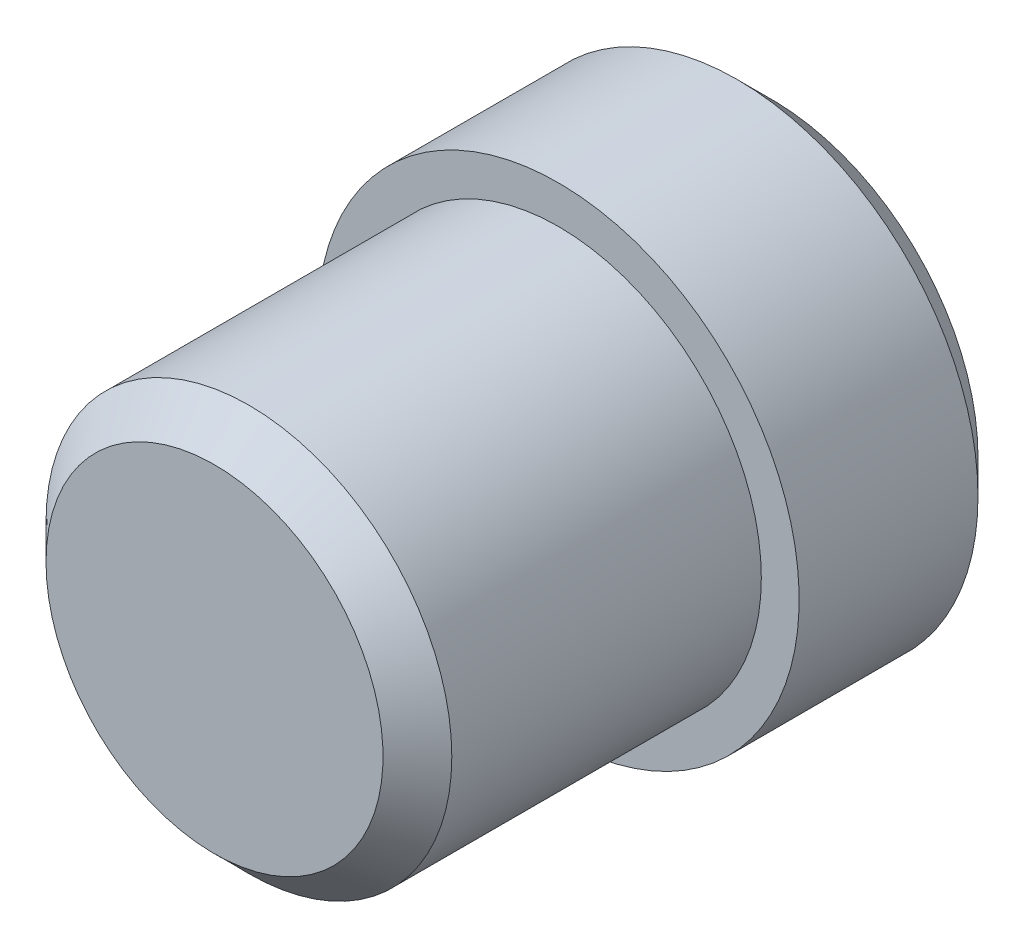
ISO-10303-21;
HEADER;
FILE_DESCRIPTION(('STEP AP214'),'2;1');
FILE_NAME('part.step','',(''),(''),'','','');
FILE_SCHEMA(('AUTOMOTIVE_DESIGN { 1 0 10303 214 1 1 1 1 }'));
ENDSEC;
DATA;
#1=APPLICATION_CONTEXT('core data for automotive mechanical design processes');
#2=APPLICATION_PROTOCOL_DEFINITION('international standard','automotive_design',2000,#1);
#3=PRODUCT_CONTEXT('',#1,'mechanical');
#4=PRODUCT('Part','Part','',(#3));
#5=PRODUCT_RELATED_PRODUCT_CATEGORY('part','',(#4));
#6=PRODUCT_DEFINITION_FORMATION('','',#4);
#7=PRODUCT_DEFINITION_CONTEXT('part definition',#1,'design');
#8=PRODUCT_DEFINITION('design','',#6,#7);
#9=PRODUCT_DEFINITION_SHAPE('','',#8);
#10=(LENGTH_UNIT() NAMED_UNIT(*) SI_UNIT(.MILLI.,.METRE.));
#11=(NAMED_UNIT(*) PLANE_ANGLE_UNIT() SI_UNIT($,.RADIAN.));
#12=(NAMED_UNIT(*) SI_UNIT($,.STERADIAN.) SOLID_ANGLE_UNIT());
#13=UNCERTAINTY_MEASURE_WITH_UNIT(LENGTH_MEASURE(1.E-05),#10,'distance_accuracy_value','');
#14=(GEOMETRIC_REPRESENTATION_CONTEXT(3) GLOBAL_UNCERTAINTY_ASSIGNED_CONTEXT((#13)) GLOBAL_UNIT_ASSIGNED_CONTEXT((#10,
#11,#12)) REPRESENTATION_CONTEXT('',''));
#15=CARTESIAN_POINT('',(0.,0.,0.));
#16=DIRECTION('',(0.,0.,1.));
#17=DIRECTION('',(1.,0.,0.));
#18=AXIS2_PLACEMENT_3D('',#15,#16,#17);
#19=CARTESIAN_POINT('',(-1.38777878078145E-13,0.,3.1));
#20=DIRECTION('',(0.,0.,0.999999999999999));
#21=DIRECTION('',(1.,0.,0.));
#22=AXIS2_PLACEMENT_3D('',#19,#20,#21);
#23=PLANE('',#22);
#24=CARTESIAN_POINT('',(-1.38777878078145E-13,0.,3.1));
#25=DIRECTION('',(0.,0.,0.999999999999999));
#26=DIRECTION('',(1.,0.,0.));
#27=AXIS2_PLACEMENT_3D('',#24,#25,#26);
#28=CIRCLE('',#27,3.5);
#29=CARTESIAN_POINT('',(-3.50000000000014,0.,3.1));
#30=VERTEX_POINT('',#29);
#31=EDGE_CURVE('E52',#30,#30,#28,.T.);
#32=ORIENTED_EDGE('',*,*,#31,.T.);
#33=EDGE_LOOP('',(#32));
#34=FACE_BOUND('',#33,.T.);
#35=CARTESIAN_POINT('',(-1.38777878078145E-13,0.,3.1));
#36=DIRECTION('',(0.,0.,0.999999999999999));
#37=DIRECTION('',(1.,0.,0.));
#38=AXIS2_PLACEMENT_3D('',#35,#36,#37);
#39=CIRCLE('',#38,2.95);
#40=CARTESIAN_POINT('',(-2.95000000000014,0.,3.1));
#41=VERTEX_POINT('',#40);
#42=EDGE_CURVE('E55',#41,#41,#39,.T.);
#43=ORIENTED_EDGE('',*,*,#42,.F.);
#44=EDGE_LOOP('',(#43));
#45=FACE_BOUND('',#44,.T.);
#46=ADVANCED_FACE('F32',(#34,#45),#23,.T.);
#47=CARTESIAN_POINT('',(-1.38777878078145E-13,0.,3.1));
#48=DIRECTION('',(0.,0.,-0.999999999999999));
#49=DIRECTION('',(-1.,0.,0.));
#50=AXIS2_PLACEMENT_3D('',#47,#48,#49);
#51=CYLINDRICAL_SURFACE('',#50,3.5);
#52=CARTESIAN_POINT('',(0.,0.,0.5));
#53=DIRECTION('',(0.,0.,0.999999999999999));
#54=DIRECTION('',(1.,0.,0.));
#55=AXIS2_PLACEMENT_3D('',#52,#53,#54);
#56=CIRCLE('',#55,3.5);
#57=CARTESIAN_POINT('',(-3.50000000000014,0.,0.5));
#58=VERTEX_POINT('',#57);
#59=EDGE_CURVE('E47',#58,#58,#56,.T.);
#60=CARTESIAN_POINT('',(-3.50000000000014,0.,0.5));
#61=CARTESIAN_POINT('',(-3.50000000000014,0.,0.527083333333333));
#62=CARTESIAN_POINT('',(-3.50000000000014,0.,0.554166666666666));
#63=CARTESIAN_POINT('',(-3.50000000000014,0.,0.608333333333333));
#64=CARTESIAN_POINT('',(-3.50000000000014,0.,0.635416666666667));
#65=CARTESIAN_POINT('',(-3.50000000000014,0.,0.689583333333333));
#66=CARTESIAN_POINT('',(-3.50000000000014,0.,0.716666666666667));
#67=CARTESIAN_POINT('',(-3.50000000000014,0.,0.770833333333333));
#68=CARTESIAN_POINT('',(-3.50000000000014,0.,0.797916666666667));
#69=CARTESIAN_POINT('',(-3.50000000000014,0.,0.852083333333334));
#70=CARTESIAN_POINT('',(-3.50000000000014,0.,0.879166666666667));
#71=CARTESIAN_POINT('',(-3.50000000000014,0.,0.933333333333333));
#72=CARTESIAN_POINT('',(-3.50000000000014,0.,0.960416666666667));
#73=CARTESIAN_POINT('',(-3.50000000000014,0.,1.01458333333333));
#74=CARTESIAN_POINT('',(-3.50000000000014,0.,1.04166666666667));
#75=CARTESIAN_POINT('',(-3.50000000000014,0.,1.09583333333333));
#76=CARTESIAN_POINT('',(-3.50000000000014,0.,1.12291666666667));
#77=CARTESIAN_POINT('',(-3.50000000000014,0.,1.17708333333333));
#78=CARTESIAN_POINT('',(-3.50000000000014,0.,1.20416666666667));
#79=CARTESIAN_POINT('',(-3.50000000000014,0.,1.25833333333333));
#80=CARTESIAN_POINT('',(-3.50000000000014,0.,1.28541666666667));
#81=CARTESIAN_POINT('',(-3.50000000000014,0.,1.33958333333333));
#82=CARTESIAN_POINT('',(-3.50000000000014,0.,1.36666666666667));
#83=CARTESIAN_POINT('',(-3.50000000000014,0.,1.42083333333333));
#84=CARTESIAN_POINT('',(-3.50000000000014,0.,1.44791666666667));
#85=CARTESIAN_POINT('',(-3.50000000000014,0.,1.50208333333333));
#86=CARTESIAN_POINT('',(-3.50000000000014,0.,1.52916666666667));
#87=CARTESIAN_POINT('',(-3.50000000000014,0.,1.58333333333333));
#88=CARTESIAN_POINT('',(-3.50000000000014,0.,1.61041666666667));
#89=CARTESIAN_POINT('',(-3.50000000000014,0.,1.66458333333333));
#90=CARTESIAN_POINT('',(-3.50000000000014,0.,1.69166666666667));
#91=CARTESIAN_POINT('',(-3.50000000000014,0.,1.74583333333333));
#92=CARTESIAN_POINT('',(-3.50000000000014,0.,1.77291666666667));
#93=CARTESIAN_POINT('',(-3.50000000000014,0.,1.82708333333333));
#94=CARTESIAN_POINT('',(-3.50000000000014,0.,1.85416666666667));
#95=CARTESIAN_POINT('',(-3.50000000000014,0.,1.90833333333333));
#96=CARTESIAN_POINT('',(-3.50000000000014,0.,1.93541666666667));
#97=CARTESIAN_POINT('',(-3.50000000000014,0.,1.98958333333333));
#98=CARTESIAN_POINT('',(-3.50000000000014,0.,2.01666666666667));
#99=CARTESIAN_POINT('',(-3.50000000000014,0.,2.07083333333333));
#100=CARTESIAN_POINT('',(-3.50000000000014,0.,2.09791666666667));
#101=CARTESIAN_POINT('',(-3.50000000000014,0.,2.15208333333333));
#102=CARTESIAN_POINT('',(-3.50000000000014,0.,2.17916666666667));
#103=CARTESIAN_POINT('',(-3.50000000000014,0.,2.23333333333333));
#104=CARTESIAN_POINT('',(-3.50000000000014,0.,2.26041666666667));
#105=CARTESIAN_POINT('',(-3.50000000000014,0.,2.31458333333333));
#106=CARTESIAN_POINT('',(-3.50000000000014,0.,2.34166666666667));
#107=CARTESIAN_POINT('',(-3.50000000000014,0.,2.39583333333333));
#108=CARTESIAN_POINT('',(-3.50000000000014,0.,2.42291666666667));
#109=CARTESIAN_POINT('',(-3.50000000000014,0.,2.47708333333333));
#110=CARTESIAN_POINT('',(-3.50000000000014,0.,2.50416666666667));
#111=CARTESIAN_POINT('',(-3.50000000000014,0.,2.55833333333333));
#112=CARTESIAN_POINT('',(-3.50000000000014,0.,2.58541666666667));
#113=CARTESIAN_POINT('',(-3.50000000000014,0.,2.63958333333333));
#114=CARTESIAN_POINT('',(-3.50000000000014,0.,2.66666666666667));
#115=CARTESIAN_POINT('',(-3.50000000000014,0.,2.72083333333333));
#116=CARTESIAN_POINT('',(-3.50000000000014,0.,2.74791666666667));
#117=CARTESIAN_POINT('',(-3.50000000000014,0.,2.80208333333333));
#118=CARTESIAN_POINT('',(-3.50000000000014,0.,2.82916666666667));
#119=CARTESIAN_POINT('',(-3.50000000000014,0.,2.88333333333333));
#120=CARTESIAN_POINT('',(-3.50000000000014,0.,2.91041666666667));
#121=CARTESIAN_POINT('',(-3.50000000000014,0.,2.96458333333333));
#122=CARTESIAN_POINT('',(-3.50000000000014,0.,2.99166666666667));
#123=CARTESIAN_POINT('',(-3.50000000000014,0.,3.04583333333333));
#124=CARTESIAN_POINT('',(-3.50000000000014,0.,3.07291666666667));
#125=CARTESIAN_POINT('',(-3.50000000000014,0.,3.1));
#126=B_SPLINE_CURVE_WITH_KNOTS('',3,(#60,#61,#62,#63,#64,#65,#66,#67,#68,#69,#70,#71,#72,#73,
#74,#75,#76,#77,#78,#79,#80,#81,#82,#83,#84,#85,#86,#87,#88,#89,#90,#91,#92,#93,#94,#95,#96,#97,
#98,#99,#100,#101,#102,#103,#104,#105,#106,#107,#108,#109,#110,#111,#112,#113,#114,#115,#116,
#117,#118,#119,#120,#121,#122,#123,#124,#125),.UNSPECIFIED.,.F.,.F.,(4,2,2,2,2,2,2,2,2,2,2,2,2,
2,2,2,2,2,2,2,2,2,2,2,2,2,2,2,2,2,2,2,4),(0.,0.0812499999999997,0.1625,0.24375,0.325,0.40625,
0.4875,0.56875,0.65,0.73125,0.8125,0.89375,0.975,1.05625,1.1375,1.21875,1.3,1.38125,1.4625,
1.54375,1.625,1.70625,1.7875,1.86875,1.95,2.03125,2.1125,2.19375,2.275,2.35625,2.4375,2.51875,
2.6),.UNSPECIFIED.);
#127=EDGE_CURVE('BSEAM62',#58,#30,#126,.T.);
#128=ORIENTED_EDGE('',*,*,#59,.T.);
#129=ORIENTED_EDGE('',*,*,#31,.F.);
#130=ORIENTED_EDGE('',*,*,#127,.T.);
#131=ORIENTED_EDGE('',*,*,#127,.F.);
#132=EDGE_LOOP('',(#128,#130,#129,#131));
#133=FACE_BOUND('',#132,.T.);
#134=ADVANCED_FACE('F62',(#133),#51,.T.);
#135=CARTESIAN_POINT('',(0.,0.,0.));
#136=DIRECTION('',(0.,0.,0.999999999999999));
#137=DIRECTION('',(1.,0.,0.));
#138=AXIS2_PLACEMENT_3D('',#135,#136,#137);
#139=PLANE('',#138);
#140=CARTESIAN_POINT('',(0.,0.,0.));
#141=DIRECTION('',(0.,0.,0.999999999999999));
#142=DIRECTION('',(1.,0.,0.));
#143=AXIS2_PLACEMENT_3D('',#140,#141,#142);
#144=CIRCLE('',#143,2.99999999999999);
#145=CARTESIAN_POINT('',(3.,0.,0.));
#146=VERTEX_POINT('',#145);
#147=EDGE_CURVE('E43',#146,#146,#144,.F.);
#148=ORIENTED_EDGE('',*,*,#147,.T.);
#149=EDGE_LOOP('',(#148));
#150=FACE_BOUND('',#149,.T.);
#151=ADVANCED_FACE('F68',(#150),#139,.F.);
#152=CARTESIAN_POINT('',(-1.38777878078145E-13,0.,8.1));
#153=DIRECTION('',(0.,0.,-0.999999999999999));
#154=DIRECTION('',(-1.,0.,0.));
#155=AXIS2_PLACEMENT_3D('',#152,#153,#154);
#156=CYLINDRICAL_SURFACE('',#155,2.95);
#157=CARTESIAN_POINT('',(-1.38777878078145E-13,0.,7.6));
#158=DIRECTION('',(0.,0.,0.999999999999999));
#159=DIRECTION('',(1.,0.,0.));
#160=AXIS2_PLACEMENT_3D('',#157,#158,#159);
#161=CIRCLE('',#160,2.95);
#162=CARTESIAN_POINT('',(-2.95000000000014,0.,7.6));
#163=VERTEX_POINT('',#162);
#164=EDGE_CURVE('E10',#163,#163,#161,.F.);
#165=CARTESIAN_POINT('',(-2.95000000000014,0.,7.6));
#166=CARTESIAN_POINT('',(-2.95000000000014,0.,7.553125));
#167=CARTESIAN_POINT('',(-2.95000000000014,0.,7.50625));
#168=CARTESIAN_POINT('',(-2.95000000000014,0.,7.4125));
#169=CARTESIAN_POINT('',(-2.95000000000014,0.,7.365625));
#170=CARTESIAN_POINT('',(-2.95000000000014,0.,7.271875));
#171=CARTESIAN_POINT('',(-2.95000000000014,0.,7.225));
#172=CARTESIAN_POINT('',(-2.95000000000014,0.,7.13125));
#173=CARTESIAN_POINT('',(-2.95000000000014,0.,7.084375));
#174=CARTESIAN_POINT('',(-2.95000000000014,0.,6.990625));
#175=CARTESIAN_POINT('',(-2.95000000000014,0.,6.94375));
#176=CARTESIAN_POINT('',(-2.95000000000014,0.,6.85));
#177=CARTESIAN_POINT('',(-2.95000000000014,0.,6.803125));
#178=CARTESIAN_POINT('',(-2.95000000000014,0.,6.709375));
#179=CARTESIAN_POINT('',(-2.95000000000014,0.,6.6625));
#180=CARTESIAN_POINT('',(-2.95000000000014,0.,6.56875));
#181=CARTESIAN_POINT('',(-2.95000000000014,0.,6.521875));
#182=CARTESIAN_POINT('',(-2.95000000000014,0.,6.428125));
#183=CARTESIAN_POINT('',(-2.95000000000014,0.,6.38125));
#184=CARTESIAN_POINT('',(-2.95000000000014,0.,6.2875));
#185=CARTESIAN_POINT('',(-2.95000000000014,0.,6.240625));
#186=CARTESIAN_POINT('',(-2.95000000000014,0.,6.146875));
#187=CARTESIAN_POINT('',(-2.95000000000014,0.,6.1));
#188=CARTESIAN_POINT('',(-2.95000000000014,0.,6.00625));
#189=CARTESIAN_POINT('',(-2.95000000000014,0.,5.959375));
#190=CARTESIAN_POINT('',(-2.95000000000014,0.,5.865625));
#191=CARTESIAN_POINT('',(-2.95000000000014,0.,5.81875));
#192=CARTESIAN_POINT('',(-2.95000000000014,0.,5.725));
#193=CARTESIAN_POINT('',(-2.95000000000014,0.,5.678125));
#194=CARTESIAN_POINT('',(-2.95000000000014,0.,5.584375));
#195=CARTESIAN_POINT('',(-2.95000000000014,0.,5.5375));
#196=CARTESIAN_POINT('',(-2.95000000000014,0.,5.44375));
#197=CARTESIAN_POINT('',(-2.95000000000014,0.,5.396875));
#198=CARTESIAN_POINT('',(-2.95000000000014,0.,5.303125));
#199=CARTESIAN_POINT('',(-2.95000000000014,0.,5.25625));
#200=CARTESIAN_POINT('',(-2.95000000000014,0.,5.1625));
#201=CARTESIAN_POINT('',(-2.95000000000014,0.,5.115625));
#202=CARTESIAN_POINT('',(-2.95000000000014,0.,5.021875));
#203=CARTESIAN_POINT('',(-2.95000000000014,0.,4.975));
#204=CARTESIAN_POINT('',(-2.95000000000014,0.,4.88125));
#205=CARTESIAN_POINT('',(-2.95000000000014,0.,4.834375));
#206=CARTESIAN_POINT('',(-2.95000000000014,0.,4.740625));
#207=CARTESIAN_POINT('',(-2.95000000000014,0.,4.69375));
#208=CARTESIAN_POINT('',(-2.95000000000014,0.,4.6));
#209=CARTESIAN_POINT('',(-2.95000000000014,0.,4.553125));
#210=CARTESIAN_POINT('',(-2.95000000000014,0.,4.459375));
#211=CARTESIAN_POINT('',(-2.95000000000014,0.,4.4125));
#212=CARTESIAN_POINT('',(-2.95000000000014,0.,4.31875));
#213=CARTESIAN_POINT('',(-2.95000000000014,0.,4.271875));
#214=CARTESIAN_POINT('',(-2.95000000000014,0.,4.178125));
#215=CARTESIAN_POINT('',(-2.95000000000014,0.,4.13125));
#216=CARTESIAN_POINT('',(-2.95000000000014,0.,4.0375));
#217=CARTESIAN_POINT('',(-2.95000000000014,0.,3.990625));
#218=CARTESIAN_POINT('',(-2.95000000000014,0.,3.896875));
#219=CARTESIAN_POINT('',(-2.95000000000014,0.,3.85));
#220=CARTESIAN_POINT('',(-2.95000000000014,0.,3.75625));
#221=CARTESIAN_POINT('',(-2.95000000000014,0.,3.709375));
#222=CARTESIAN_POINT('',(-2.95000000000014,0.,3.615625));
#223=CARTESIAN_POINT('',(-2.95000000000014,0.,3.56875));
#224=CARTESIAN_POINT('',(-2.95000000000014,0.,3.475));
#225=CARTESIAN_POINT('',(-2.95000000000014,0.,3.428125));
#226=CARTESIAN_POINT('',(-2.95000000000014,0.,3.334375));
#227=CARTESIAN_POINT('',(-2.95000000000014,0.,3.2875));
#228=CARTESIAN_POINT('',(-2.95000000000014,0.,3.19375));
#229=CARTESIAN_POINT('',(-2.95000000000014,0.,3.146875));
#230=CARTESIAN_POINT('',(-2.95000000000014,0.,3.1));
#231=B_SPLINE_CURVE_WITH_KNOTS('',3,(#165,#166,#167,#168,#169,#170,#171,#172,#173,#174,#175,
#176,#177,#178,#179,#180,#181,#182,#183,#184,#185,#186,#187,#188,#189,#190,#191,#192,#193,#194,
#195,#196,#197,#198,#199,#200,#201,#202,#203,#204,#205,#206,#207,#208,#209,#210,#211,#212,#213,
#214,#215,#216,#217,#218,#219,#220,#221,#222,#223,#224,#225,#226,#227,#228,#229,#230),
.UNSPECIFIED.,.F.,.F.,(4,2,2,2,2,2,2,2,2,2,2,2,2,2,2,2,2,2,2,2,2,2,2,2,2,2,2,2,2,2,2,2,4),(0.,
0.140625,0.28125,0.421875,0.5625,0.703125,0.84375,0.984375,1.125,1.265625,1.40625,1.546875,
1.6875,1.828125,1.96875,2.109375,2.25,2.390625,2.53125,2.671875,2.8125,2.953125,3.09375,
3.234375,3.375,3.515625,3.65625,3.796875,3.9375,4.078125,4.21875,4.359375,4.5),.UNSPECIFIED.);
#232=EDGE_CURVE('BSEAM59',#163,#41,#231,.T.);
#233=ORIENTED_EDGE('',*,*,#164,.T.);
#234=ORIENTED_EDGE('',*,*,#42,.T.);
#235=ORIENTED_EDGE('',*,*,#232,.T.);
#236=ORIENTED_EDGE('',*,*,#232,.F.);
#237=EDGE_LOOP('',(#233,#235,#234,#236));
#238=FACE_BOUND('',#237,.T.);
#239=ADVANCED_FACE('F59',(#238),#156,.T.);
#240=CARTESIAN_POINT('',(-1.38777878078145E-13,0.,8.1));
#241=DIRECTION('',(0.,0.,0.999999999999999));
#242=DIRECTION('',(1.,0.,0.));
#243=AXIS2_PLACEMENT_3D('',#240,#241,#242);
#244=PLANE('',#243);
#245=CARTESIAN_POINT('',(-1.38777878078145E-13,0.,8.1));
#246=DIRECTION('',(0.,0.,0.999999999999999));
#247=DIRECTION('',(1.,0.,0.));
#248=AXIS2_PLACEMENT_3D('',#245,#246,#247);
#249=CIRCLE('',#248,2.45);
#250=CARTESIAN_POINT('',(-2.45000000000014,0.,8.1));
#251=VERTEX_POINT('',#250);
#252=EDGE_CURVE('E39',#251,#251,#249,.T.);
#253=ORIENTED_EDGE('',*,*,#252,.T.);
#254=EDGE_LOOP('',(#253));
#255=FACE_BOUND('',#254,.T.);
#256=ADVANCED_FACE('F78',(#255),#244,.T.);
#257=CARTESIAN_POINT('',(0.,0.,0.5));
#258=DIRECTION('',(0.,0.,0.999999999999999));
#259=DIRECTION('',(1.,0.,0.));
#260=AXIS2_PLACEMENT_3D('',#257,#258,#259);
#261=CONICAL_SURFACE('',#260,3.5,0.78539816339745);
#262=ORIENTED_EDGE('',*,*,#147,.F.);
#263=EDGE_LOOP('',(#262));
#264=FACE_BOUND('',#263,.T.);
#265=ORIENTED_EDGE('',*,*,#59,.F.);
#266=EDGE_LOOP('',(#265));
#267=FACE_BOUND('',#266,.T.);
#268=ADVANCED_FACE('F76',(#264,#267),#261,.T.);
#269=CARTESIAN_POINT('',(-1.38777878078145E-13,0.,8.1));
#270=DIRECTION('',(0.,0.,-0.999999999999999));
#271=DIRECTION('',(-1.,0.,0.));
#272=AXIS2_PLACEMENT_3D('',#269,#270,#271);
#273=CONICAL_SURFACE('',#272,2.45,0.785398163397445);
#274=CARTESIAN_POINT('',(-2.95000000000014,0.,7.6));
#275=CARTESIAN_POINT('',(-2.94479166666681,0.,7.60520833333333));
#276=CARTESIAN_POINT('',(-2.93958333333347,0.,7.61041666666666));
#277=CARTESIAN_POINT('',(-2.92916666666681,0.,7.62083333333333));
#278=CARTESIAN_POINT('',(-2.92395833333347,0.,7.62604166666666));
#279=CARTESIAN_POINT('',(-2.91354166666681,0.,7.63645833333333));
#280=CARTESIAN_POINT('',(-2.90833333333347,0.,7.64166666666666));
#281=CARTESIAN_POINT('',(-2.89791666666681,0.,7.65208333333333));
#282=CARTESIAN_POINT('',(-2.89270833333347,0.,7.65729166666666));
#283=CARTESIAN_POINT('',(-2.88229166666681,0.,7.66770833333333));
#284=CARTESIAN_POINT('',(-2.87708333333347,0.,7.67291666666666));
#285=CARTESIAN_POINT('',(-2.86666666666681,0.,7.68333333333333));
#286=CARTESIAN_POINT('',(-2.86145833333347,0.,7.68854166666666));
#287=CARTESIAN_POINT('',(-2.85104166666681,0.,7.69895833333333));
#288=CARTESIAN_POINT('',(-2.84583333333347,0.,7.70416666666666));
#289=CARTESIAN_POINT('',(-2.83541666666681,0.,7.71458333333333));
#290=CARTESIAN_POINT('',(-2.83020833333347,0.,7.71979166666666));
#291=CARTESIAN_POINT('',(-2.81979166666681,0.,7.73020833333333));
#292=CARTESIAN_POINT('',(-2.81458333333347,0.,7.73541666666666));
#293=CARTESIAN_POINT('',(-2.80416666666681,0.,7.74583333333333));
#294=CARTESIAN_POINT('',(-2.79895833333347,0.,7.75104166666666));
#295=CARTESIAN_POINT('',(-2.78854166666681,0.,7.76145833333333));
#296=CARTESIAN_POINT('',(-2.78333333333347,0.,7.76666666666666));
#297=CARTESIAN_POINT('',(-2.77291666666681,0.,7.77708333333333));
#298=CARTESIAN_POINT('',(-2.76770833333347,0.,7.78229166666666));
#299=CARTESIAN_POINT('',(-2.75729166666681,0.,7.79270833333333));
#300=CARTESIAN_POINT('',(-2.75208333333347,0.,7.79791666666666));
#301=CARTESIAN_POINT('',(-2.74166666666681,0.,7.80833333333333));
#302=CARTESIAN_POINT('',(-2.73645833333347,0.,7.81354166666666));
#303=CARTESIAN_POINT('',(-2.72604166666681,0.,7.82395833333333));
#304=CARTESIAN_POINT('',(-2.72083333333347,0.,7.82916666666666));
#305=CARTESIAN_POINT('',(-2.71041666666681,0.,7.83958333333333));
#306=CARTESIAN_POINT('',(-2.70520833333347,0.,7.84479166666666));
#307=CARTESIAN_POINT('',(-2.69479166666681,0.,7.85520833333333));
#308=CARTESIAN_POINT('',(-2.68958333333347,0.,7.86041666666666));
#309=CARTESIAN_POINT('',(-2.67916666666681,0.,7.87083333333333));
#310=CARTESIAN_POINT('',(-2.67395833333347,0.,7.87604166666666));
#311=CARTESIAN_POINT('',(-2.66354166666681,0.,7.88645833333333));
#312=CARTESIAN_POINT('',(-2.65833333333347,0.,7.89166666666666));
#313=CARTESIAN_POINT('',(-2.64791666666681,0.,7.90208333333333));
#314=CARTESIAN_POINT('',(-2.64270833333347,0.,7.90729166666666));
#315=CARTESIAN_POINT('',(-2.63229166666681,0.,7.91770833333333));
#316=CARTESIAN_POINT('',(-2.62708333333347,0.,7.92291666666666));
#317=CARTESIAN_POINT('',(-2.61666666666681,0.,7.93333333333333));
#318=CARTESIAN_POINT('',(-2.61145833333347,0.,7.93854166666666));
#319=CARTESIAN_POINT('',(-2.60104166666681,0.,7.94895833333333));
#320=CARTESIAN_POINT('',(-2.59583333333347,0.,7.95416666666666));
#321=CARTESIAN_POINT('',(-2.58541666666681,0.,7.96458333333333));
#322=CARTESIAN_POINT('',(-2.58020833333347,0.,7.96979166666666));
#323=CARTESIAN_POINT('',(-2.56979166666681,0.,7.98020833333333));
#324=CARTESIAN_POINT('',(-2.56458333333347,0.,7.98541666666666));
#325=CARTESIAN_POINT('',(-2.55416666666681,0.,7.99583333333333));
#326=CARTESIAN_POINT('',(-2.54895833333347,0.,8.00104166666667));
#327=CARTESIAN_POINT('',(-2.53854166666681,0.,8.01145833333333));
#328=CARTESIAN_POINT('',(-2.53333333333347,0.,8.01666666666667));
#329=CARTESIAN_POINT('',(-2.52291666666681,0.,8.02708333333333));
#330=CARTESIAN_POINT('',(-2.51770833333347,0.,8.03229166666667));
#331=CARTESIAN_POINT('',(-2.50729166666681,0.,8.04270833333333));
#332=CARTESIAN_POINT('',(-2.50208333333347,0.,8.04791666666667));
#333=CARTESIAN_POINT('',(-2.49166666666681,0.,8.05833333333333));
#334=CARTESIAN_POINT('',(-2.48645833333347,0.,8.06354166666667));
#335=CARTESIAN_POINT('',(-2.47604166666681,0.,8.07395833333333));
#336=CARTESIAN_POINT('',(-2.47083333333347,0.,8.07916666666667));
#337=CARTESIAN_POINT('',(-2.46041666666681,0.,8.08958333333333));
#338=CARTESIAN_POINT('',(-2.45520833333347,0.,8.09479166666667));
#339=CARTESIAN_POINT('',(-2.45000000000014,0.,8.1));
#340=B_SPLINE_CURVE_WITH_KNOTS('',3,(#274,#275,#276,#277,#278,#279,#280,#281,#282,#283,#284,
#285,#286,#287,#288,#289,#290,#291,#292,#293,#294,#295,#296,#297,#298,#299,#300,#301,#302,#303,
#304,#305,#306,#307,#308,#309,#310,#311,#312,#313,#314,#315,#316,#317,#318,#319,#320,#321,#322,
#323,#324,#325,#326,#327,#328,#329,#330,#331,#332,#333,#334,#335,#336,#337,#338,#339),
.UNSPECIFIED.,.F.,.F.,(4,2,2,2,2,2,2,2,2,2,2,2,2,2,2,2,2,2,2,2,2,2,2,2,2,2,2,2,2,2,2,2,4),(0.,
0.0220970869120796,0.0441941738241593,0.0662912607362383,0.0883883476483179,0.110485434560398,
0.132582521472477,0.154679608384556,0.176776695296636,0.198873782208716,0.220970869120795,
0.243067956032875,0.265165042944954,0.287262129857034,0.309359216769114,0.331456303681194,
0.353553390593273,0.375650477505353,0.397747564417432,0.419844651329512,0.441941738241591,
0.464038825153671,0.486135912065751,0.50823299897783,0.53033008588991,0.552427172801989,
0.574524259714069,0.596621346626149,0.618718433538228,0.640815520450308,0.662912607362387,
0.685009694274467,0.707106781186546),.UNSPECIFIED.);
#341=EDGE_CURVE('BSEAM34',#163,#251,#340,.T.);
#342=ORIENTED_EDGE('',*,*,#164,.F.);
#343=ORIENTED_EDGE('',*,*,#252,.F.);
#344=ORIENTED_EDGE('',*,*,#341,.T.);
#345=ORIENTED_EDGE('',*,*,#341,.F.);
#346=EDGE_LOOP('',(#342,#344,#343,#345));
#347=FACE_BOUND('',#346,.T.);
#348=ADVANCED_FACE('F34',(#347),#273,.T.);
#349=CLOSED_SHELL('',(#46,#134,#151,#239,#256,#268,#348));
#350=MANIFOLD_SOLID_BREP('B2',#349);
#351=ADVANCED_BREP_SHAPE_REPRESENTATION('',(#18,#350),#14);
#352=SHAPE_DEFINITION_REPRESENTATION(#9,#351);
ENDSEC;
END-ISO-10303-21;
